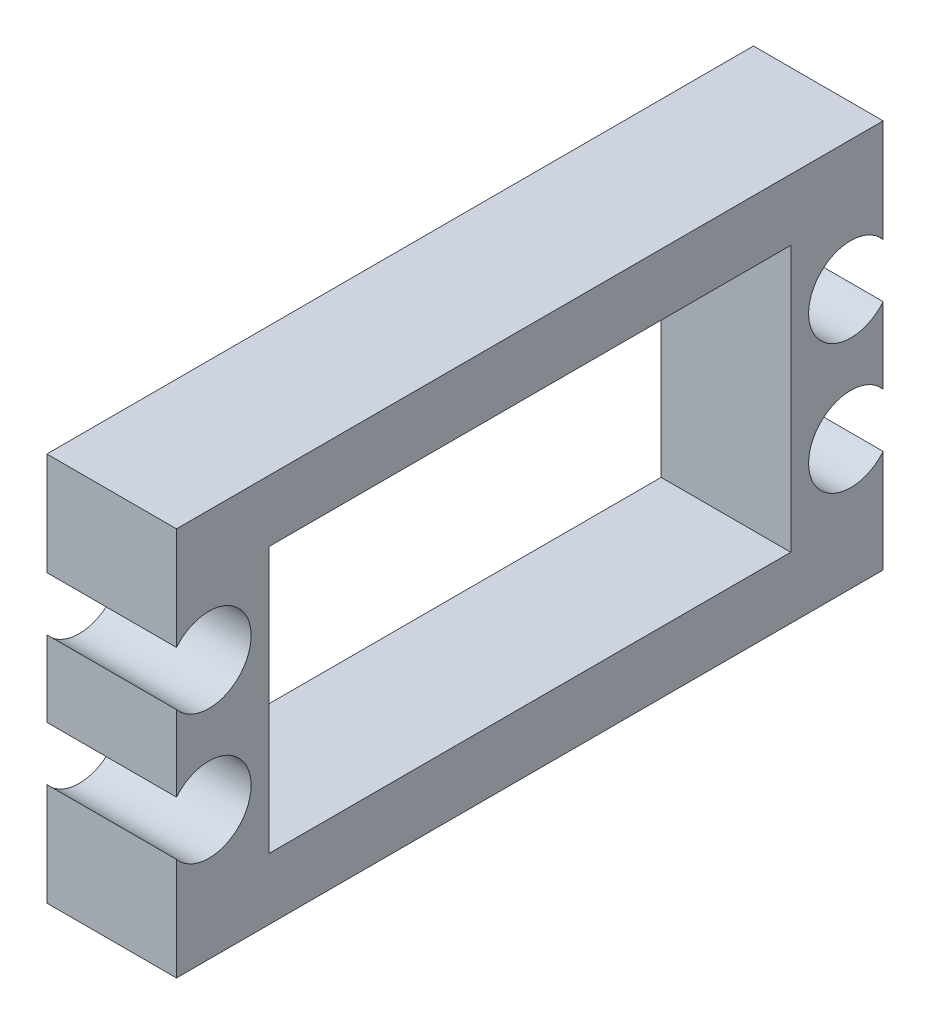
ISO-10303-21;
HEADER;
FILE_DESCRIPTION(('STEP AP214'),'2;1');
FILE_NAME('part.step','',(''),(''),'','','');
FILE_SCHEMA(('AUTOMOTIVE_DESIGN { 1 0 10303 214 1 1 1 1 }'));
ENDSEC;
DATA;
#1=APPLICATION_CONTEXT('core data for automotive mechanical design processes');
#2=APPLICATION_PROTOCOL_DEFINITION('international standard','automotive_design',2000,#1);
#3=PRODUCT_CONTEXT('',#1,'mechanical');
#4=PRODUCT('Part','Part','',(#3));
#5=PRODUCT_RELATED_PRODUCT_CATEGORY('part','',(#4));
#6=PRODUCT_DEFINITION_FORMATION('','',#4);
#7=PRODUCT_DEFINITION_CONTEXT('part definition',#1,'design');
#8=PRODUCT_DEFINITION('design','',#6,#7);
#9=PRODUCT_DEFINITION_SHAPE('','',#8);
#10=(LENGTH_UNIT() NAMED_UNIT(*) SI_UNIT(.MILLI.,.METRE.));
#11=(NAMED_UNIT(*) PLANE_ANGLE_UNIT() SI_UNIT($,.RADIAN.));
#12=(NAMED_UNIT(*) SI_UNIT($,.STERADIAN.) SOLID_ANGLE_UNIT());
#13=UNCERTAINTY_MEASURE_WITH_UNIT(LENGTH_MEASURE(1.E-05),#10,'distance_accuracy_value','');
#14=(GEOMETRIC_REPRESENTATION_CONTEXT(3) GLOBAL_UNCERTAINTY_ASSIGNED_CONTEXT((#13)) GLOBAL_UNIT_ASSIGNED_CONTEXT((#10,
#11,#12)) REPRESENTATION_CONTEXT('',''));
#15=CARTESIAN_POINT('',(0.,0.,0.));
#16=DIRECTION('',(0.,0.,1.));
#17=DIRECTION('',(1.,0.,0.));
#18=AXIS2_PLACEMENT_3D('',#15,#16,#17);
#19=CARTESIAN_POINT('',(10.,25.75,-27.25));
#20=DIRECTION('',(0.,0.,1.));
#21=DIRECTION('',(0.,-1.,0.));
#22=AXIS2_PLACEMENT_3D('',#19,#20,#21);
#23=PLANE('',#22);
#24=DIRECTION('',(0.,1.,0.));
#25=VECTOR('',#24,1.);
#26=CARTESIAN_POINT('',(0.,25.75,-27.25));
#27=LINE('',#26,#25);
#28=CARTESIAN_POINT('',(0.,-4.25000000000001,-27.25));
#29=VERTEX_POINT('',#28);
#30=CARTESIAN_POINT('',(0.,3.67334403427046,-27.25));
#31=VERTEX_POINT('',#30);
#32=EDGE_CURVE('E209',#29,#31,#27,.T.);
#33=ORIENTED_EDGE('',*,*,#32,.T.);
#34=DIRECTION('',(1.,0.,0.));
#35=VECTOR('',#34,1.);
#36=CARTESIAN_POINT('',(-10.,3.67334403427048,-27.25));
#37=LINE('',#36,#35);
#38=CARTESIAN_POINT('',(10.,3.67334403427046,-27.25));
#39=VERTEX_POINT('',#38);
#40=EDGE_CURVE('E11',#31,#39,#37,.T.);
#41=ORIENTED_EDGE('',*,*,#40,.T.);
#42=DIRECTION('',(0.,1.,0.));
#43=VECTOR('',#42,1.);
#44=CARTESIAN_POINT('',(10.,25.75,-27.25));
#45=LINE('',#44,#43);
#46=CARTESIAN_POINT('',(10.,-4.25000000000001,-27.25));
#47=VERTEX_POINT('',#46);
#48=EDGE_CURVE('E194',#47,#39,#45,.T.);
#49=ORIENTED_EDGE('',*,*,#48,.F.);
#50=DIRECTION('',(-1.,0.,0.));
#51=VECTOR('',#50,1.);
#52=CARTESIAN_POINT('',(10.,-4.25000000000001,-27.25));
#53=LINE('',#52,#51);
#54=EDGE_CURVE('E202',#47,#29,#53,.T.);
#55=ORIENTED_EDGE('',*,*,#54,.T.);
#56=EDGE_LOOP('',(#33,#41,#49,#55));
#57=FACE_BOUND('',#56,.T.);
#58=ADVANCED_FACE('F45',(#57),#23,.F.);
#59=CARTESIAN_POINT('',(10.,7.8266559657295,-27.25));
#60=VERTEX_POINT('',#59);
#61=CARTESIAN_POINT('',(10.,13.6733440342705,-27.25));
#62=VERTEX_POINT('',#61);
#63=EDGE_CURVE('E260',#60,#62,#45,.T.);
#64=ORIENTED_EDGE('',*,*,#63,.F.);
#65=DIRECTION('',(1.,0.,0.));
#66=VECTOR('',#65,1.);
#67=CARTESIAN_POINT('',(-10.,7.8266559657295,-27.25));
#68=LINE('',#67,#66);
#69=CARTESIAN_POINT('',(0.,7.82665596572949,-27.25));
#70=VERTEX_POINT('',#69);
#71=EDGE_CURVE('E54',#60,#70,#68,.F.);
#72=ORIENTED_EDGE('',*,*,#71,.T.);
#73=CARTESIAN_POINT('',(0.,13.6733440342705,-27.25));
#74=VERTEX_POINT('',#73);
#75=EDGE_CURVE('E214',#70,#74,#27,.T.);
#76=ORIENTED_EDGE('',*,*,#75,.T.);
#77=DIRECTION('',(1.,0.,0.));
#78=VECTOR('',#77,1.);
#79=CARTESIAN_POINT('',(-10.,13.6733440342705,-27.25));
#80=LINE('',#79,#78);
#81=EDGE_CURVE('E250',#74,#62,#80,.T.);
#82=ORIENTED_EDGE('',*,*,#81,.T.);
#83=EDGE_LOOP('',(#64,#72,#76,#82));
#84=FACE_BOUND('',#83,.T.);
#85=ADVANCED_FACE('F258',(#84),#23,.F.);
#86=CARTESIAN_POINT('',(10.,25.75,27.25));
#87=DIRECTION('',(0.,0.,-1.));
#88=DIRECTION('',(0.,1.,0.));
#89=AXIS2_PLACEMENT_3D('',#86,#87,#88);
#90=PLANE('',#89);
#91=DIRECTION('',(0.,-1.,0.));
#92=VECTOR('',#91,1.);
#93=CARTESIAN_POINT('',(0.,25.75,27.25));
#94=LINE('',#93,#92);
#95=CARTESIAN_POINT('',(0.,25.75,27.25));
#96=VERTEX_POINT('',#95);
#97=CARTESIAN_POINT('',(0.,17.8266559657295,27.25));
#98=VERTEX_POINT('',#97);
#99=EDGE_CURVE('E219',#96,#98,#94,.T.);
#100=ORIENTED_EDGE('',*,*,#99,.T.);
#101=DIRECTION('',(1.,0.,0.));
#102=VECTOR('',#101,1.);
#103=CARTESIAN_POINT('',(-10.,17.8266559657295,27.25));
#104=LINE('',#103,#102);
#105=CARTESIAN_POINT('',(10.,17.8266559657295,27.25));
#106=VERTEX_POINT('',#105);
#107=EDGE_CURVE('E243',#98,#106,#104,.T.);
#108=ORIENTED_EDGE('',*,*,#107,.T.);
#109=DIRECTION('',(0.,-1.,0.));
#110=VECTOR('',#109,1.);
#111=CARTESIAN_POINT('',(10.,25.75,27.25));
#112=LINE('',#111,#110);
#113=CARTESIAN_POINT('',(10.,25.75,27.25));
#114=VERTEX_POINT('',#113);
#115=EDGE_CURVE('E191',#114,#106,#112,.T.);
#116=ORIENTED_EDGE('',*,*,#115,.F.);
#117=DIRECTION('',(-1.,0.,0.));
#118=VECTOR('',#117,1.);
#119=CARTESIAN_POINT('',(10.,25.75,27.25));
#120=LINE('',#119,#118);
#121=EDGE_CURVE('E230',#114,#96,#120,.T.);
#122=ORIENTED_EDGE('',*,*,#121,.T.);
#123=EDGE_LOOP('',(#100,#108,#116,#122));
#124=FACE_BOUND('',#123,.T.);
#125=ADVANCED_FACE('F307',(#124),#90,.F.);
#126=CARTESIAN_POINT('',(10.,13.6733440342705,27.25));
#127=VERTEX_POINT('',#126);
#128=CARTESIAN_POINT('',(10.,7.8266559657295,27.25));
#129=VERTEX_POINT('',#128);
#130=EDGE_CURVE('E180',#127,#129,#112,.T.);
#131=ORIENTED_EDGE('',*,*,#130,.F.);
#132=DIRECTION('',(1.,0.,0.));
#133=VECTOR('',#132,1.);
#134=CARTESIAN_POINT('',(-10.,13.6733440342705,27.25));
#135=LINE('',#134,#133);
#136=CARTESIAN_POINT('',(0.,13.6733440342705,27.25));
#137=VERTEX_POINT('',#136);
#138=EDGE_CURVE('E239',#127,#137,#135,.F.);
#139=ORIENTED_EDGE('',*,*,#138,.T.);
#140=CARTESIAN_POINT('',(0.,7.8266559657295,27.25));
#141=VERTEX_POINT('',#140);
#142=EDGE_CURVE('E224',#137,#141,#94,.T.);
#143=ORIENTED_EDGE('',*,*,#142,.T.);
#144=DIRECTION('',(1.,0.,0.));
#145=VECTOR('',#144,1.);
#146=CARTESIAN_POINT('',(-10.,7.82665596572951,27.25));
#147=LINE('',#146,#145);
#148=EDGE_CURVE('E169',#141,#129,#147,.T.);
#149=ORIENTED_EDGE('',*,*,#148,.T.);
#150=EDGE_LOOP('',(#131,#139,#143,#149));
#151=FACE_BOUND('',#150,.T.);
#152=ADVANCED_FACE('F311',(#151),#90,.F.);
#153=CARTESIAN_POINT('',(10.,0.,0.));
#154=DIRECTION('',(1.,0.,0.));
#155=DIRECTION('',(0.,0.,-1.));
#156=AXIS2_PLACEMENT_3D('',#153,#154,#155);
#157=PLANE('',#156);
#158=CARTESIAN_POINT('',(10.,15.75,24.75));
#159=DIRECTION('',(1.,0.,0.));
#160=DIRECTION('',(0.,0.,-1.));
#161=AXIS2_PLACEMENT_3D('',#158,#159,#160);
#162=CIRCLE('',#161,3.25);
#163=EDGE_CURVE('E453',#127,#106,#162,.T.);
#164=ORIENTED_EDGE('',*,*,#163,.F.);
#165=ORIENTED_EDGE('',*,*,#130,.T.);
#166=CARTESIAN_POINT('',(10.,5.74999999999999,24.75));
#167=DIRECTION('',(1.,0.,0.));
#168=DIRECTION('',(0.,0.,1.));
#169=AXIS2_PLACEMENT_3D('',#166,#167,#168);
#170=CIRCLE('',#169,3.25);
#171=CARTESIAN_POINT('',(10.,3.67334403427046,27.25));
#172=VERTEX_POINT('',#171);
#173=EDGE_CURVE('E161',#172,#129,#170,.T.);
#174=ORIENTED_EDGE('',*,*,#173,.F.);
#175=CARTESIAN_POINT('',(10.,-4.25000000000001,27.25));
#176=VERTEX_POINT('',#175);
#177=EDGE_CURVE('E177',#172,#176,#112,.T.);
#178=ORIENTED_EDGE('',*,*,#177,.T.);
#179=DIRECTION('',(0.,0.,-1.));
#180=VECTOR('',#179,1.);
#181=CARTESIAN_POINT('',(10.,-4.25000000000001,27.25));
#182=LINE('',#181,#180);
#183=EDGE_CURVE('E199',#176,#47,#182,.T.);
#184=ORIENTED_EDGE('',*,*,#183,.T.);
#185=ORIENTED_EDGE('',*,*,#48,.T.);
#186=CARTESIAN_POINT('',(10.,5.74999999999999,-24.75));
#187=DIRECTION('',(1.,0.,0.));
#188=DIRECTION('',(0.,0.,-1.));
#189=AXIS2_PLACEMENT_3D('',#186,#187,#188);
#190=CIRCLE('',#189,3.25);
#191=EDGE_CURVE('E182',#60,#39,#190,.T.);
#192=ORIENTED_EDGE('',*,*,#191,.F.);
#193=ORIENTED_EDGE('',*,*,#63,.T.);
#194=CARTESIAN_POINT('',(10.,15.75,-24.75));
#195=DIRECTION('',(1.,0.,0.));
#196=DIRECTION('',(0.,0.,1.));
#197=AXIS2_PLACEMENT_3D('',#194,#195,#196);
#198=CIRCLE('',#197,3.25);
#199=CARTESIAN_POINT('',(10.,17.8266559657295,-27.25));
#200=VERTEX_POINT('',#199);
#201=EDGE_CURVE('E294',#200,#62,#198,.T.);
#202=ORIENTED_EDGE('',*,*,#201,.F.);
#203=CARTESIAN_POINT('',(10.,25.75,-27.25));
#204=VERTEX_POINT('',#203);
#205=EDGE_CURVE('E226',#200,#204,#45,.T.);
#206=ORIENTED_EDGE('',*,*,#205,.T.);
#207=DIRECTION('',(0.,0.,1.));
#208=VECTOR('',#207,1.);
#209=CARTESIAN_POINT('',(10.,25.75,27.25));
#210=LINE('',#209,#208);
#211=EDGE_CURVE('E189',#204,#114,#210,.T.);
#212=ORIENTED_EDGE('',*,*,#211,.T.);
#213=ORIENTED_EDGE('',*,*,#115,.T.);
#214=EDGE_LOOP('',(#164,#165,#174,#178,#184,#185,#192,#193,#202,#206,#212,#213));
#215=FACE_BOUND('',#214,.T.);
#216=DIRECTION('',(0.,0.,-1.));
#217=VECTOR('',#216,1.);
#218=CARTESIAN_POINT('',(10.,0.499999999999985,20.125));
#219=LINE('',#218,#217);
#220=CARTESIAN_POINT('',(10.,0.499999999999985,20.125));
#221=VERTEX_POINT('',#220);
#222=CARTESIAN_POINT('',(10.,0.499999999999985,-20.125));
#223=VERTEX_POINT('',#222);
#224=EDGE_CURVE('E476',#221,#223,#219,.T.);
#225=ORIENTED_EDGE('',*,*,#224,.F.);
#226=DIRECTION('',(0.,-1.,0.));
#227=VECTOR('',#226,1.);
#228=CARTESIAN_POINT('',(10.,21.,20.125));
#229=LINE('',#228,#227);
#230=CARTESIAN_POINT('',(10.,21.,20.125));
#231=VERTEX_POINT('',#230);
#232=EDGE_CURVE('E473',#231,#221,#229,.T.);
#233=ORIENTED_EDGE('',*,*,#232,.F.);
#234=DIRECTION('',(0.,0.,1.));
#235=VECTOR('',#234,1.);
#236=CARTESIAN_POINT('',(10.,21.,20.125));
#237=LINE('',#236,#235);
#238=CARTESIAN_POINT('',(10.,21.,-20.125));
#239=VERTEX_POINT('',#238);
#240=EDGE_CURVE('E484',#239,#231,#237,.T.);
#241=ORIENTED_EDGE('',*,*,#240,.F.);
#242=DIRECTION('',(0.,1.,0.));
#243=VECTOR('',#242,1.);
#244=CARTESIAN_POINT('',(10.,21.,-20.125));
#245=LINE('',#244,#243);
#246=EDGE_CURVE('E480',#223,#239,#245,.T.);
#247=ORIENTED_EDGE('',*,*,#246,.F.);
#248=EDGE_LOOP('',(#225,#233,#241,#247));
#249=FACE_BOUND('',#248,.T.);
#250=ADVANCED_FACE('F175',(#215,#249),#157,.T.);
#251=CARTESIAN_POINT('',(0.,0.,0.));
#252=DIRECTION('',(1.,0.,0.));
#253=DIRECTION('',(0.,0.,-1.));
#254=AXIS2_PLACEMENT_3D('',#251,#252,#253);
#255=PLANE('',#254);
#256=ORIENTED_EDGE('',*,*,#142,.F.);
#257=CARTESIAN_POINT('',(0.,15.75,24.75));
#258=DIRECTION('',(1.,0.,0.));
#259=DIRECTION('',(0.,0.,-1.));
#260=AXIS2_PLACEMENT_3D('',#257,#258,#259);
#261=CIRCLE('',#260,3.25);
#262=EDGE_CURVE('E455',#137,#98,#261,.T.);
#263=ORIENTED_EDGE('',*,*,#262,.T.);
#264=ORIENTED_EDGE('',*,*,#99,.F.);
#265=DIRECTION('',(0.,0.,1.));
#266=VECTOR('',#265,1.);
#267=CARTESIAN_POINT('',(0.,25.75,27.25));
#268=LINE('',#267,#266);
#269=CARTESIAN_POINT('',(0.,25.75,-27.25));
#270=VERTEX_POINT('',#269);
#271=EDGE_CURVE('E213',#270,#96,#268,.T.);
#272=ORIENTED_EDGE('',*,*,#271,.F.);
#273=CARTESIAN_POINT('',(0.,17.8266559657295,-27.25));
#274=VERTEX_POINT('',#273);
#275=EDGE_CURVE('E215',#274,#270,#27,.T.);
#276=ORIENTED_EDGE('',*,*,#275,.F.);
#277=CARTESIAN_POINT('',(0.,15.75,-24.75));
#278=DIRECTION('',(1.,0.,0.));
#279=DIRECTION('',(0.,0.,-1.));
#280=AXIS2_PLACEMENT_3D('',#277,#278,#279);
#281=CIRCLE('',#280,3.25);
#282=EDGE_CURVE('E61',#274,#74,#281,.T.);
#283=ORIENTED_EDGE('',*,*,#282,.T.);
#284=ORIENTED_EDGE('',*,*,#75,.F.);
#285=CARTESIAN_POINT('',(0.,5.74999999999999,-24.75));
#286=DIRECTION('',(1.,0.,0.));
#287=DIRECTION('',(0.,0.,-1.));
#288=AXIS2_PLACEMENT_3D('',#285,#286,#287);
#289=CIRCLE('',#288,3.25);
#290=EDGE_CURVE('E69',#70,#31,#289,.T.);
#291=ORIENTED_EDGE('',*,*,#290,.T.);
#292=ORIENTED_EDGE('',*,*,#32,.F.);
#293=DIRECTION('',(0.,0.,-1.));
#294=VECTOR('',#293,1.);
#295=CARTESIAN_POINT('',(0.,-4.25000000000001,27.25));
#296=LINE('',#295,#294);
#297=CARTESIAN_POINT('',(0.,-4.25000000000001,27.25));
#298=VERTEX_POINT('',#297);
#299=EDGE_CURVE('E223',#298,#29,#296,.T.);
#300=ORIENTED_EDGE('',*,*,#299,.F.);
#301=CARTESIAN_POINT('',(0.,3.67334403427046,27.25));
#302=VERTEX_POINT('',#301);
#303=EDGE_CURVE('E218',#302,#298,#94,.T.);
#304=ORIENTED_EDGE('',*,*,#303,.F.);
#305=CARTESIAN_POINT('',(0.,5.74999999999999,24.75));
#306=DIRECTION('',(1.,0.,0.));
#307=DIRECTION('',(0.,0.,-1.));
#308=AXIS2_PLACEMENT_3D('',#305,#306,#307);
#309=CIRCLE('',#308,3.25);
#310=EDGE_CURVE('E164',#302,#141,#309,.T.);
#311=ORIENTED_EDGE('',*,*,#310,.T.);
#312=EDGE_LOOP('',(#256,#263,#264,#272,#276,#283,#284,#291,#292,#300,#304,#311));
#313=FACE_BOUND('',#312,.T.);
#314=DIRECTION('',(0.,-1.,0.));
#315=VECTOR('',#314,1.);
#316=CARTESIAN_POINT('',(0.,21.,20.125));
#317=LINE('',#316,#315);
#318=CARTESIAN_POINT('',(0.,21.,20.125));
#319=VERTEX_POINT('',#318);
#320=CARTESIAN_POINT('',(0.,0.499999999999985,20.125));
#321=VERTEX_POINT('',#320);
#322=EDGE_CURVE('E472',#319,#321,#317,.T.);
#323=ORIENTED_EDGE('',*,*,#322,.T.);
#324=DIRECTION('',(0.,0.,-1.));
#325=VECTOR('',#324,1.);
#326=CARTESIAN_POINT('',(0.,0.499999999999985,20.125));
#327=LINE('',#326,#325);
#328=CARTESIAN_POINT('',(0.,0.499999999999985,-20.125));
#329=VERTEX_POINT('',#328);
#330=EDGE_CURVE('E490',#321,#329,#327,.T.);
#331=ORIENTED_EDGE('',*,*,#330,.T.);
#332=DIRECTION('',(0.,1.,0.));
#333=VECTOR('',#332,1.);
#334=CARTESIAN_POINT('',(0.,21.,-20.125));
#335=LINE('',#334,#333);
#336=CARTESIAN_POINT('',(0.,21.,-20.125));
#337=VERTEX_POINT('',#336);
#338=EDGE_CURVE('E494',#329,#337,#335,.T.);
#339=ORIENTED_EDGE('',*,*,#338,.T.);
#340=DIRECTION('',(0.,0.,1.));
#341=VECTOR('',#340,1.);
#342=CARTESIAN_POINT('',(0.,21.,20.125));
#343=LINE('',#342,#341);
#344=EDGE_CURVE('E477',#337,#319,#343,.T.);
#345=ORIENTED_EDGE('',*,*,#344,.T.);
#346=EDGE_LOOP('',(#323,#331,#339,#345));
#347=FACE_BOUND('',#346,.T.);
#348=ADVANCED_FACE('F264',(#313,#347),#255,.F.);
#349=ORIENTED_EDGE('',*,*,#205,.F.);
#350=DIRECTION('',(1.,0.,0.));
#351=VECTOR('',#350,1.);
#352=CARTESIAN_POINT('',(-10.,17.8266559657295,-27.25));
#353=LINE('',#352,#351);
#354=EDGE_CURVE('E247',#200,#274,#353,.F.);
#355=ORIENTED_EDGE('',*,*,#354,.T.);
#356=ORIENTED_EDGE('',*,*,#275,.T.);
#357=DIRECTION('',(-1.,0.,0.));
#358=VECTOR('',#357,1.);
#359=CARTESIAN_POINT('',(10.,25.75,-27.25));
#360=LINE('',#359,#358);
#361=EDGE_CURVE('E170',#204,#270,#360,.T.);
#362=ORIENTED_EDGE('',*,*,#361,.F.);
#363=EDGE_LOOP('',(#349,#355,#356,#362));
#364=FACE_BOUND('',#363,.T.);
#365=ADVANCED_FACE('F47',(#364),#23,.F.);
#366=CARTESIAN_POINT('',(10.,25.75,27.25));
#367=DIRECTION('',(0.,-1.,0.));
#368=DIRECTION('',(0.,0.,-1.));
#369=AXIS2_PLACEMENT_3D('',#366,#367,#368);
#370=PLANE('',#369);
#371=ORIENTED_EDGE('',*,*,#271,.T.);
#372=ORIENTED_EDGE('',*,*,#121,.F.);
#373=ORIENTED_EDGE('',*,*,#211,.F.);
#374=ORIENTED_EDGE('',*,*,#361,.T.);
#375=EDGE_LOOP('',(#371,#372,#373,#374));
#376=FACE_BOUND('',#375,.T.);
#377=ADVANCED_FACE('F296',(#376),#370,.F.);
#378=ORIENTED_EDGE('',*,*,#177,.F.);
#379=DIRECTION('',(1.,0.,0.));
#380=VECTOR('',#379,1.);
#381=CARTESIAN_POINT('',(-10.,3.67334403427046,27.25));
#382=LINE('',#381,#380);
#383=EDGE_CURVE('E158',#172,#302,#382,.F.);
#384=ORIENTED_EDGE('',*,*,#383,.T.);
#385=ORIENTED_EDGE('',*,*,#303,.T.);
#386=DIRECTION('',(-1.,0.,0.));
#387=VECTOR('',#386,1.);
#388=CARTESIAN_POINT('',(10.,-4.25000000000001,27.25));
#389=LINE('',#388,#387);
#390=EDGE_CURVE('E186',#176,#298,#389,.T.);
#391=ORIENTED_EDGE('',*,*,#390,.F.);
#392=EDGE_LOOP('',(#378,#384,#385,#391));
#393=FACE_BOUND('',#392,.T.);
#394=ADVANCED_FACE('F184',(#393),#90,.F.);
#395=CARTESIAN_POINT('',(10.,-4.25000000000001,27.25));
#396=DIRECTION('',(0.,1.,0.));
#397=DIRECTION('',(0.,0.,1.));
#398=AXIS2_PLACEMENT_3D('',#395,#396,#397);
#399=PLANE('',#398);
#400=ORIENTED_EDGE('',*,*,#299,.T.);
#401=ORIENTED_EDGE('',*,*,#54,.F.);
#402=ORIENTED_EDGE('',*,*,#183,.F.);
#403=ORIENTED_EDGE('',*,*,#390,.T.);
#404=EDGE_LOOP('',(#400,#401,#402,#403));
#405=FACE_BOUND('',#404,.T.);
#406=ADVANCED_FACE('F319',(#405),#399,.F.);
#407=CARTESIAN_POINT('',(10.,21.,20.125));
#408=DIRECTION('',(0.,0.,-1.));
#409=DIRECTION('',(-1.,0.,0.));
#410=AXIS2_PLACEMENT_3D('',#407,#408,#409);
#411=PLANE('',#410);
#412=ORIENTED_EDGE('',*,*,#322,.F.);
#413=DIRECTION('',(-1.,0.,0.));
#414=VECTOR('',#413,1.);
#415=CARTESIAN_POINT('',(10.,21.,20.125));
#416=LINE('',#415,#414);
#417=EDGE_CURVE('E487',#231,#319,#416,.T.);
#418=ORIENTED_EDGE('',*,*,#417,.F.);
#419=ORIENTED_EDGE('',*,*,#232,.T.);
#420=DIRECTION('',(-1.,0.,0.));
#421=VECTOR('',#420,1.);
#422=CARTESIAN_POINT('',(10.,0.499999999999985,20.125));
#423=LINE('',#422,#421);
#424=EDGE_CURVE('E270',#221,#321,#423,.T.);
#425=ORIENTED_EDGE('',*,*,#424,.T.);
#426=EDGE_LOOP('',(#412,#418,#419,#425));
#427=FACE_BOUND('',#426,.T.);
#428=ADVANCED_FACE('F324',(#427),#411,.T.);
#429=CARTESIAN_POINT('',(10.,0.499999999999985,20.125));
#430=DIRECTION('',(0.,1.,0.));
#431=DIRECTION('',(0.,0.,1.));
#432=AXIS2_PLACEMENT_3D('',#429,#430,#431);
#433=PLANE('',#432);
#434=ORIENTED_EDGE('',*,*,#330,.F.);
#435=ORIENTED_EDGE('',*,*,#424,.F.);
#436=ORIENTED_EDGE('',*,*,#224,.T.);
#437=DIRECTION('',(-1.,0.,0.));
#438=VECTOR('',#437,1.);
#439=CARTESIAN_POINT('',(10.,0.499999999999985,-20.125));
#440=LINE('',#439,#438);
#441=EDGE_CURVE('E276',#223,#329,#440,.T.);
#442=ORIENTED_EDGE('',*,*,#441,.T.);
#443=EDGE_LOOP('',(#434,#435,#436,#442));
#444=FACE_BOUND('',#443,.T.);
#445=ADVANCED_FACE('F329',(#444),#433,.T.);
#446=CARTESIAN_POINT('',(10.,21.,-20.125));
#447=DIRECTION('',(0.,0.,1.));
#448=DIRECTION('',(1.,0.,0.));
#449=AXIS2_PLACEMENT_3D('',#446,#447,#448);
#450=PLANE('',#449);
#451=ORIENTED_EDGE('',*,*,#338,.F.);
#452=ORIENTED_EDGE('',*,*,#441,.F.);
#453=ORIENTED_EDGE('',*,*,#246,.T.);
#454=DIRECTION('',(-1.,0.,0.));
#455=VECTOR('',#454,1.);
#456=CARTESIAN_POINT('',(10.,21.,-20.125));
#457=LINE('',#456,#455);
#458=EDGE_CURVE('E282',#239,#337,#457,.T.);
#459=ORIENTED_EDGE('',*,*,#458,.T.);
#460=EDGE_LOOP('',(#451,#452,#453,#459));
#461=FACE_BOUND('',#460,.T.);
#462=ADVANCED_FACE('F336',(#461),#450,.T.);
#463=CARTESIAN_POINT('',(10.,21.,20.125));
#464=DIRECTION('',(0.,-1.,0.));
#465=DIRECTION('',(0.,0.,-1.));
#466=AXIS2_PLACEMENT_3D('',#463,#464,#465);
#467=PLANE('',#466);
#468=ORIENTED_EDGE('',*,*,#344,.F.);
#469=ORIENTED_EDGE('',*,*,#458,.F.);
#470=ORIENTED_EDGE('',*,*,#240,.T.);
#471=ORIENTED_EDGE('',*,*,#417,.T.);
#472=EDGE_LOOP('',(#468,#469,#470,#471));
#473=FACE_BOUND('',#472,.T.);
#474=ADVANCED_FACE('F340',(#473),#467,.T.);
#475=CARTESIAN_POINT('',(-10.,5.74999999999999,24.75));
#476=DIRECTION('',(1.,0.,0.));
#477=DIRECTION('',(0.,0.,-1.));
#478=AXIS2_PLACEMENT_3D('',#475,#476,#477);
#479=CYLINDRICAL_SURFACE('',#478,3.25);
#480=ORIENTED_EDGE('',*,*,#383,.F.);
#481=ORIENTED_EDGE('',*,*,#173,.T.);
#482=ORIENTED_EDGE('',*,*,#148,.F.);
#483=ORIENTED_EDGE('',*,*,#310,.F.);
#484=EDGE_LOOP('',(#480,#481,#482,#483));
#485=FACE_BOUND('',#484,.T.);
#486=ADVANCED_FACE('F160',(#485),#479,.F.);
#487=CARTESIAN_POINT('',(-10.,15.75,24.75));
#488=DIRECTION('',(1.,0.,0.));
#489=DIRECTION('',(0.,0.,-1.));
#490=AXIS2_PLACEMENT_3D('',#487,#488,#489);
#491=CYLINDRICAL_SURFACE('',#490,3.25);
#492=ORIENTED_EDGE('',*,*,#138,.F.);
#493=ORIENTED_EDGE('',*,*,#163,.T.);
#494=ORIENTED_EDGE('',*,*,#107,.F.);
#495=ORIENTED_EDGE('',*,*,#262,.F.);
#496=EDGE_LOOP('',(#492,#493,#494,#495));
#497=FACE_BOUND('',#496,.T.);
#498=ADVANCED_FACE('F349',(#497),#491,.F.);
#499=CARTESIAN_POINT('',(-10.,15.75,-24.75));
#500=DIRECTION('',(1.,0.,0.));
#501=DIRECTION('',(0.,0.,-1.));
#502=AXIS2_PLACEMENT_3D('',#499,#500,#501);
#503=CYLINDRICAL_SURFACE('',#502,3.25);
#504=ORIENTED_EDGE('',*,*,#354,.F.);
#505=ORIENTED_EDGE('',*,*,#201,.T.);
#506=ORIENTED_EDGE('',*,*,#81,.F.);
#507=ORIENTED_EDGE('',*,*,#282,.F.);
#508=EDGE_LOOP('',(#504,#505,#506,#507));
#509=FACE_BOUND('',#508,.T.);
#510=ADVANCED_FACE('F345',(#509),#503,.F.);
#511=CARTESIAN_POINT('',(-10.,5.74999999999999,-24.75));
#512=DIRECTION('',(1.,0.,0.));
#513=DIRECTION('',(0.,0.,-1.));
#514=AXIS2_PLACEMENT_3D('',#511,#512,#513);
#515=CYLINDRICAL_SURFACE('',#514,3.25);
#516=ORIENTED_EDGE('',*,*,#71,.F.);
#517=ORIENTED_EDGE('',*,*,#191,.T.);
#518=ORIENTED_EDGE('',*,*,#40,.F.);
#519=ORIENTED_EDGE('',*,*,#290,.F.);
#520=EDGE_LOOP('',(#516,#517,#518,#519));
#521=FACE_BOUND('',#520,.T.);
#522=ADVANCED_FACE('F348',(#521),#515,.F.);
#523=CLOSED_SHELL('',(#58,#85,#125,#152,#250,#348,#365,#377,#394,#406,#428,#445,#462,#474,#486,
#498,#510,#522));
#524=MANIFOLD_SOLID_BREP('B2',#523);
#525=ADVANCED_BREP_SHAPE_REPRESENTATION('',(#18,#524),#14);
#526=SHAPE_DEFINITION_REPRESENTATION(#9,#525);
ENDSEC;
END-ISO-10303-21;
